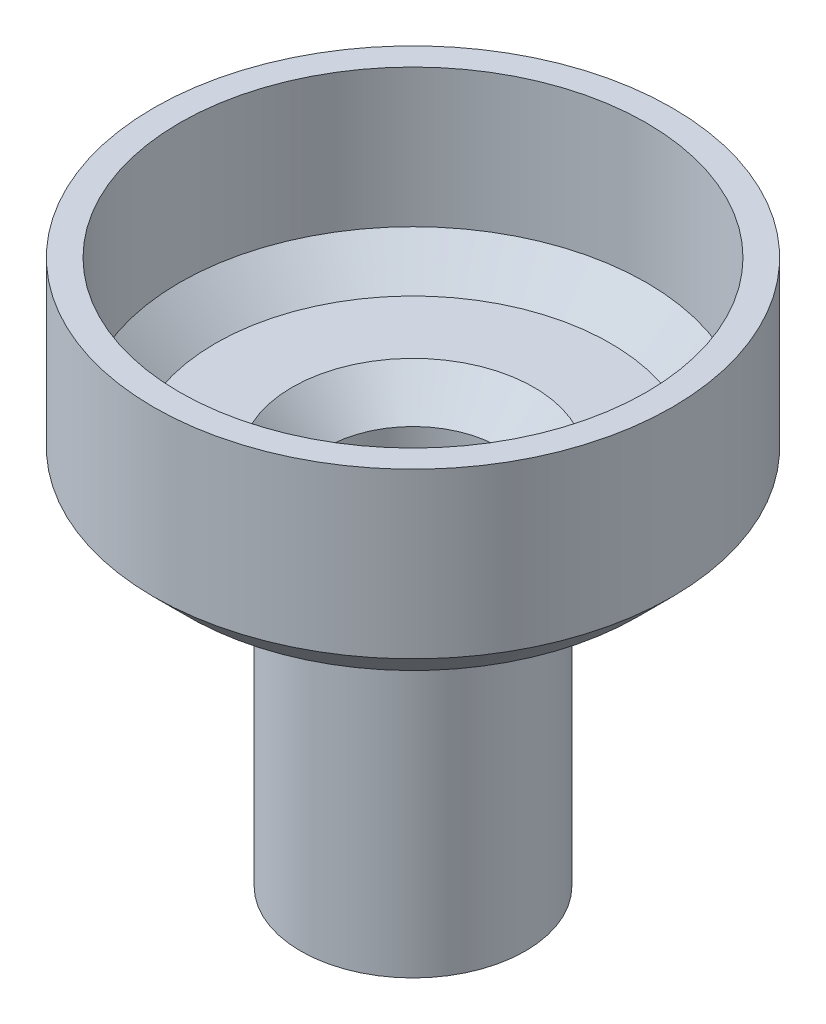
ISO-10303-21;
HEADER;
FILE_DESCRIPTION(('STEP AP214'),'2;1');
FILE_NAME('part.step','',(''),(''),'','','');
FILE_SCHEMA(('AUTOMOTIVE_DESIGN { 1 0 10303 214 1 1 1 1 }'));
ENDSEC;
DATA;
#1=APPLICATION_CONTEXT('core data for automotive mechanical design processes');
#2=APPLICATION_PROTOCOL_DEFINITION('international standard','automotive_design',2000,#1);
#3=PRODUCT_CONTEXT('',#1,'mechanical');
#4=PRODUCT('Part','Part','',(#3));
#5=PRODUCT_RELATED_PRODUCT_CATEGORY('part','',(#4));
#6=PRODUCT_DEFINITION_FORMATION('','',#4);
#7=PRODUCT_DEFINITION_CONTEXT('part definition',#1,'design');
#8=PRODUCT_DEFINITION('design','',#6,#7);
#9=PRODUCT_DEFINITION_SHAPE('','',#8);
#10=(LENGTH_UNIT() NAMED_UNIT(*) SI_UNIT(.MILLI.,.METRE.));
#11=(NAMED_UNIT(*) PLANE_ANGLE_UNIT() SI_UNIT($,.RADIAN.));
#12=(NAMED_UNIT(*) SI_UNIT($,.STERADIAN.) SOLID_ANGLE_UNIT());
#13=UNCERTAINTY_MEASURE_WITH_UNIT(LENGTH_MEASURE(1.E-05),#10,'distance_accuracy_value','');
#14=(GEOMETRIC_REPRESENTATION_CONTEXT(3) GLOBAL_UNCERTAINTY_ASSIGNED_CONTEXT((#13)) GLOBAL_UNIT_ASSIGNED_CONTEXT((#10,
#11,#12)) REPRESENTATION_CONTEXT('',''));
#15=CARTESIAN_POINT('',(0.,0.,0.));
#16=DIRECTION('',(0.,0.,1.));
#17=DIRECTION('',(1.,0.,0.));
#18=AXIS2_PLACEMENT_3D('',#15,#16,#17);
#19=CARTESIAN_POINT('',(5.,-1.5,0.));
#20=DIRECTION('',(0.,-1.,0.));
#21=DIRECTION('',(1.,0.,0.));
#22=AXIS2_PLACEMENT_3D('',#19,#20,#21);
#23=PLANE('',#22);
#24=CARTESIAN_POINT('',(0.,-1.50000000000002,0.));
#25=DIRECTION('',(0.,-1.,0.));
#26=DIRECTION('',(1.,0.,0.));
#27=AXIS2_PLACEMENT_3D('',#24,#25,#26);
#28=CIRCLE('',#27,2.);
#29=CARTESIAN_POINT('',(2.,-1.50000000000001,0.));
#30=VERTEX_POINT('',#29);
#31=EDGE_CURVE('E80',#30,#30,#28,.F.);
#32=ORIENTED_EDGE('',*,*,#31,.T.);
#33=EDGE_LOOP('',(#32));
#34=FACE_BOUND('',#33,.T.);
#35=CARTESIAN_POINT('',(0.,-1.5,0.));
#36=DIRECTION('',(0.,-1.,0.));
#37=DIRECTION('',(1.,0.,0.));
#38=AXIS2_PLACEMENT_3D('',#35,#36,#37);
#39=CIRCLE('',#38,6.5);
#40=CARTESIAN_POINT('',(6.5,-1.49999999999998,0.));
#41=VERTEX_POINT('',#40);
#42=EDGE_CURVE('E10',#41,#41,#39,.T.);
#43=ORIENTED_EDGE('',*,*,#42,.T.);
#44=EDGE_LOOP('',(#43));
#45=FACE_BOUND('',#44,.T.);
#46=ADVANCED_FACE('F37',(#34,#45),#23,.T.);
#47=CARTESIAN_POINT('',(1.01990468588935E-12,-297.326720660989,0.));
#48=DIRECTION('',(0.,-1.,0.));
#49=DIRECTION('',(1.,0.,0.));
#50=AXIS2_PLACEMENT_3D('',#47,#48,#49);
#51=CYLINDRICAL_SURFACE('',#50,6.50000000000003);
#52=CARTESIAN_POINT('',(0.,16.5,0.));
#53=DIRECTION('',(0.,-1.,0.));
#54=DIRECTION('',(1.,0.,0.));
#55=AXIS2_PLACEMENT_3D('',#52,#53,#54);
#56=CIRCLE('',#55,6.50000000000006);
#57=CARTESIAN_POINT('',(6.5,16.5,0.));
#58=VERTEX_POINT('',#57);
#59=EDGE_CURVE('E43',#58,#58,#56,.T.);
#60=ORIENTED_EDGE('',*,*,#59,.T.);
#61=EDGE_LOOP('',(#60));
#62=FACE_BOUND('',#61,.T.);
#63=ORIENTED_EDGE('',*,*,#42,.F.);
#64=EDGE_LOOP('',(#63));
#65=FACE_BOUND('',#64,.T.);
#66=ADVANCED_FACE('F153',(#62,#65),#51,.T.);
#67=CARTESIAN_POINT('',(0.,16.5,0.));
#68=DIRECTION('',(0.,1.,0.));
#69=DIRECTION('',(-1.,0.,0.));
#70=AXIS2_PLACEMENT_3D('',#67,#68,#69);
#71=CONICAL_SURFACE('',#70,6.50000000000006,0.785398163397464);
#72=CARTESIAN_POINT('',(0.,18.5,0.));
#73=DIRECTION('',(0.,-1.,0.));
#74=DIRECTION('',(1.,0.,0.));
#75=AXIS2_PLACEMENT_3D('',#72,#73,#74);
#76=CIRCLE('',#75,8.50000000000007);
#77=CARTESIAN_POINT('',(8.5,18.5,0.));
#78=VERTEX_POINT('',#77);
#79=EDGE_CURVE('E47',#78,#78,#76,.T.);
#80=ORIENTED_EDGE('',*,*,#79,.T.);
#81=EDGE_LOOP('',(#80));
#82=FACE_BOUND('',#81,.T.);
#83=ORIENTED_EDGE('',*,*,#59,.F.);
#84=EDGE_LOOP('',(#83));
#85=FACE_BOUND('',#84,.T.);
#86=ADVANCED_FACE('F147',(#82,#85),#71,.T.);
#87=CARTESIAN_POINT('',(13.,18.5,0.));
#88=DIRECTION('',(0.,-1.,0.));
#89=DIRECTION('',(1.,0.,0.));
#90=AXIS2_PLACEMENT_3D('',#87,#88,#89);
#91=PLANE('',#90);
#92=CARTESIAN_POINT('',(0.,18.5,0.));
#93=DIRECTION('',(0.,-1.,0.));
#94=DIRECTION('',(1.,0.,0.));
#95=AXIS2_PLACEMENT_3D('',#92,#93,#94);
#96=CIRCLE('',#95,13.0000000000001);
#97=CARTESIAN_POINT('',(13.,18.5,0.));
#98=VERTEX_POINT('',#97);
#99=EDGE_CURVE('E51',#98,#98,#96,.T.);
#100=ORIENTED_EDGE('',*,*,#99,.T.);
#101=EDGE_LOOP('',(#100));
#102=FACE_BOUND('',#101,.T.);
#103=ORIENTED_EDGE('',*,*,#79,.F.);
#104=EDGE_LOOP('',(#103));
#105=FACE_BOUND('',#104,.T.);
#106=ADVANCED_FACE('F141',(#102,#105),#91,.T.);
#107=CARTESIAN_POINT('',(0.,18.5,0.));
#108=DIRECTION('',(0.,1.,0.));
#109=DIRECTION('',(-1.,0.,0.));
#110=AXIS2_PLACEMENT_3D('',#107,#108,#109);
#111=CONICAL_SURFACE('',#110,13.0000000000001,0.78539816339745);
#112=CARTESIAN_POINT('',(0.,20.5,0.));
#113=DIRECTION('',(0.,-1.,0.));
#114=DIRECTION('',(1.,0.,0.));
#115=AXIS2_PLACEMENT_3D('',#112,#113,#114);
#116=CIRCLE('',#115,15.0000000000001);
#117=CARTESIAN_POINT('',(15.,20.5,0.));
#118=VERTEX_POINT('',#117);
#119=EDGE_CURVE('E56',#118,#118,#116,.T.);
#120=ORIENTED_EDGE('',*,*,#119,.T.);
#121=EDGE_LOOP('',(#120));
#122=FACE_BOUND('',#121,.T.);
#123=ORIENTED_EDGE('',*,*,#99,.F.);
#124=EDGE_LOOP('',(#123));
#125=FACE_BOUND('',#124,.T.);
#126=ADVANCED_FACE('F135',(#122,#125),#111,.T.);
#127=CARTESIAN_POINT('',(1.01990468588935E-12,-297.326720660989,0.));
#128=DIRECTION('',(0.,-1.,0.));
#129=DIRECTION('',(1.,0.,0.));
#130=AXIS2_PLACEMENT_3D('',#127,#128,#129);
#131=CYLINDRICAL_SURFACE('',#130,15.0000000000001);
#132=CARTESIAN_POINT('',(-1.02907469966573E-13,30.,0.));
#133=DIRECTION('',(0.,-1.,0.));
#134=DIRECTION('',(1.,0.,0.));
#135=AXIS2_PLACEMENT_3D('',#132,#133,#134);
#136=CIRCLE('',#135,15.0000000000001);
#137=CARTESIAN_POINT('',(15.,30.,0.));
#138=VERTEX_POINT('',#137);
#139=EDGE_CURVE('E59',#138,#138,#136,.T.);
#140=ORIENTED_EDGE('',*,*,#139,.T.);
#141=EDGE_LOOP('',(#140));
#142=FACE_BOUND('',#141,.T.);
#143=ORIENTED_EDGE('',*,*,#119,.F.);
#144=EDGE_LOOP('',(#143));
#145=FACE_BOUND('',#144,.T.);
#146=ADVANCED_FACE('F129',(#142,#145),#131,.T.);
#147=CARTESIAN_POINT('',(15.,30.,0.));
#148=DIRECTION('',(0.,1.,0.));
#149=DIRECTION('',(-1.,0.,0.));
#150=AXIS2_PLACEMENT_3D('',#147,#148,#149);
#151=PLANE('',#150);
#152=CARTESIAN_POINT('',(-1.02907469966573E-13,30.,0.));
#153=DIRECTION('',(0.,-1.,0.));
#154=DIRECTION('',(1.,0.,0.));
#155=AXIS2_PLACEMENT_3D('',#152,#153,#154);
#156=CIRCLE('',#155,13.5000000000001);
#157=CARTESIAN_POINT('',(13.5,30.,0.));
#158=VERTEX_POINT('',#157);
#159=EDGE_CURVE('E62',#158,#158,#156,.T.);
#160=ORIENTED_EDGE('',*,*,#159,.T.);
#161=EDGE_LOOP('',(#160));
#162=FACE_BOUND('',#161,.T.);
#163=ORIENTED_EDGE('',*,*,#139,.F.);
#164=EDGE_LOOP('',(#163));
#165=FACE_BOUND('',#164,.T.);
#166=ADVANCED_FACE('F123',(#162,#165),#151,.T.);
#167=CARTESIAN_POINT('',(1.01990468588935E-12,-297.326720660989,0.));
#168=DIRECTION('',(0.,-1.,0.));
#169=DIRECTION('',(1.,0.,0.));
#170=AXIS2_PLACEMENT_3D('',#167,#168,#169);
#171=CYLINDRICAL_SURFACE('',#170,13.5000000000001);
#172=CARTESIAN_POINT('',(0.,22.,0.));
#173=DIRECTION('',(0.,-1.,0.));
#174=DIRECTION('',(1.,0.,0.));
#175=AXIS2_PLACEMENT_3D('',#172,#173,#174);
#176=CIRCLE('',#175,13.5000000000001);
#177=CARTESIAN_POINT('',(13.5,22.,0.));
#178=VERTEX_POINT('',#177);
#179=EDGE_CURVE('E65',#178,#178,#176,.T.);
#180=ORIENTED_EDGE('',*,*,#179,.T.);
#181=EDGE_LOOP('',(#180));
#182=FACE_BOUND('',#181,.T.);
#183=ORIENTED_EDGE('',*,*,#159,.F.);
#184=EDGE_LOOP('',(#183));
#185=FACE_BOUND('',#184,.T.);
#186=ADVANCED_FACE('F117',(#182,#185),#171,.F.);
#187=CARTESIAN_POINT('',(0.,22.,0.));
#188=DIRECTION('',(0.,1.,0.));
#189=DIRECTION('',(-1.,0.,0.));
#190=AXIS2_PLACEMENT_3D('',#187,#188,#189);
#191=CONICAL_SURFACE('',#190,13.5000000000001,0.805334507587732);
#192=CARTESIAN_POINT('',(0.,20.,0.));
#193=DIRECTION('',(0.,-1.,0.));
#194=DIRECTION('',(1.,0.,0.));
#195=AXIS2_PLACEMENT_3D('',#192,#193,#194);
#196=CIRCLE('',#195,11.4186214506705);
#197=CARTESIAN_POINT('',(11.4186214506704,20.,0.));
#198=VERTEX_POINT('',#197);
#199=EDGE_CURVE('E68',#198,#198,#196,.T.);
#200=ORIENTED_EDGE('',*,*,#199,.T.);
#201=EDGE_LOOP('',(#200));
#202=FACE_BOUND('',#201,.T.);
#203=ORIENTED_EDGE('',*,*,#179,.F.);
#204=EDGE_LOOP('',(#203));
#205=FACE_BOUND('',#204,.T.);
#206=ADVANCED_FACE('F111',(#202,#205),#191,.F.);
#207=CARTESIAN_POINT('',(7.,20.,0.));
#208=DIRECTION('',(0.,1.,0.));
#209=DIRECTION('',(-1.,0.,0.));
#210=AXIS2_PLACEMENT_3D('',#207,#208,#209);
#211=PLANE('',#210);
#212=CARTESIAN_POINT('',(0.,20.,0.));
#213=DIRECTION('',(0.,-1.,0.));
#214=DIRECTION('',(1.,0.,0.));
#215=AXIS2_PLACEMENT_3D('',#212,#213,#214);
#216=CIRCLE('',#215,7.00000000000007);
#217=CARTESIAN_POINT('',(7.,20.,0.));
#218=VERTEX_POINT('',#217);
#219=EDGE_CURVE('E71',#218,#218,#216,.T.);
#220=ORIENTED_EDGE('',*,*,#219,.T.);
#221=EDGE_LOOP('',(#220));
#222=FACE_BOUND('',#221,.T.);
#223=ORIENTED_EDGE('',*,*,#199,.F.);
#224=EDGE_LOOP('',(#223));
#225=FACE_BOUND('',#224,.T.);
#226=ADVANCED_FACE('F105',(#222,#225),#211,.T.);
#227=CARTESIAN_POINT('',(0.,20.,0.));
#228=DIRECTION('',(0.,1.,0.));
#229=DIRECTION('',(-1.,0.,0.));
#230=AXIS2_PLACEMENT_3D('',#227,#228,#229);
#231=CONICAL_SURFACE('',#230,7.00000000000007,0.78539816339745);
#232=CARTESIAN_POINT('',(0.,18.,0.));
#233=DIRECTION('',(0.,-1.,0.));
#234=DIRECTION('',(1.,0.,0.));
#235=AXIS2_PLACEMENT_3D('',#232,#233,#234);
#236=CIRCLE('',#235,5.00000000000006);
#237=CARTESIAN_POINT('',(5.,18.,0.));
#238=VERTEX_POINT('',#237);
#239=EDGE_CURVE('E74',#238,#238,#236,.T.);
#240=ORIENTED_EDGE('',*,*,#239,.T.);
#241=EDGE_LOOP('',(#240));
#242=FACE_BOUND('',#241,.T.);
#243=ORIENTED_EDGE('',*,*,#219,.F.);
#244=EDGE_LOOP('',(#243));
#245=FACE_BOUND('',#244,.T.);
#246=ADVANCED_FACE('F99',(#242,#245),#231,.F.);
#247=CARTESIAN_POINT('',(1.01990468588935E-12,-297.326720660989,0.));
#248=DIRECTION('',(0.,-1.,0.));
#249=DIRECTION('',(1.,0.,0.));
#250=AXIS2_PLACEMENT_3D('',#247,#248,#249);
#251=CYLINDRICAL_SURFACE('',#250,5.00000000000003);
#252=CARTESIAN_POINT('',(0.,0.,0.));
#253=DIRECTION('',(0.,-1.,0.));
#254=DIRECTION('',(1.,0.,0.));
#255=AXIS2_PLACEMENT_3D('',#252,#253,#254);
#256=CIRCLE('',#255,5.);
#257=CARTESIAN_POINT('',(5.,0.,0.));
#258=VERTEX_POINT('',#257);
#259=EDGE_CURVE('E77',#258,#258,#256,.T.);
#260=ORIENTED_EDGE('',*,*,#259,.T.);
#261=EDGE_LOOP('',(#260));
#262=FACE_BOUND('',#261,.T.);
#263=ORIENTED_EDGE('',*,*,#239,.F.);
#264=EDGE_LOOP('',(#263));
#265=FACE_BOUND('',#264,.T.);
#266=ADVANCED_FACE('F93',(#262,#265),#251,.F.);
#267=CARTESIAN_POINT('',(0.,0.,0.));
#268=DIRECTION('',(0.,1.,0.));
#269=DIRECTION('',(-1.,0.,0.));
#270=AXIS2_PLACEMENT_3D('',#267,#268,#269);
#271=PLANE('',#270);
#272=CARTESIAN_POINT('',(0.,0.,0.));
#273=DIRECTION('',(0.,1.,0.));
#274=DIRECTION('',(-1.,0.,0.));
#275=AXIS2_PLACEMENT_3D('',#272,#273,#274);
#276=CIRCLE('',#275,2.);
#277=CARTESIAN_POINT('',(-2.,0.,0.));
#278=VERTEX_POINT('',#277);
#279=EDGE_CURVE('E83',#278,#278,#276,.T.);
#280=ORIENTED_EDGE('',*,*,#279,.F.);
#281=EDGE_LOOP('',(#280));
#282=FACE_BOUND('',#281,.T.);
#283=ORIENTED_EDGE('',*,*,#259,.F.);
#284=EDGE_LOOP('',(#283));
#285=FACE_BOUND('',#284,.T.);
#286=ADVANCED_FACE('F90',(#282,#285),#271,.T.);
#287=CARTESIAN_POINT('',(0.,-7.15685424949239,0.));
#288=DIRECTION('',(0.,1.,0.));
#289=DIRECTION('',(0.,0.,1.));
#290=AXIS2_PLACEMENT_3D('',#287,#288,#289);
#291=CYLINDRICAL_SURFACE('',#290,2.);
#292=ORIENTED_EDGE('',*,*,#279,.T.);
#293=EDGE_LOOP('',(#292));
#294=FACE_BOUND('',#293,.T.);
#295=ORIENTED_EDGE('',*,*,#31,.F.);
#296=EDGE_LOOP('',(#295));
#297=FACE_BOUND('',#296,.T.);
#298=ADVANCED_FACE('F87',(#294,#297),#291,.F.);
#299=CLOSED_SHELL('',(#46,#66,#86,#106,#126,#146,#166,#186,#206,#226,#246,#266,#286,#298));
#300=MANIFOLD_SOLID_BREP('B2',#299);
#301=ADVANCED_BREP_SHAPE_REPRESENTATION('',(#18,#300),#14);
#302=SHAPE_DEFINITION_REPRESENTATION(#9,#301);
ENDSEC;
END-ISO-10303-21;
